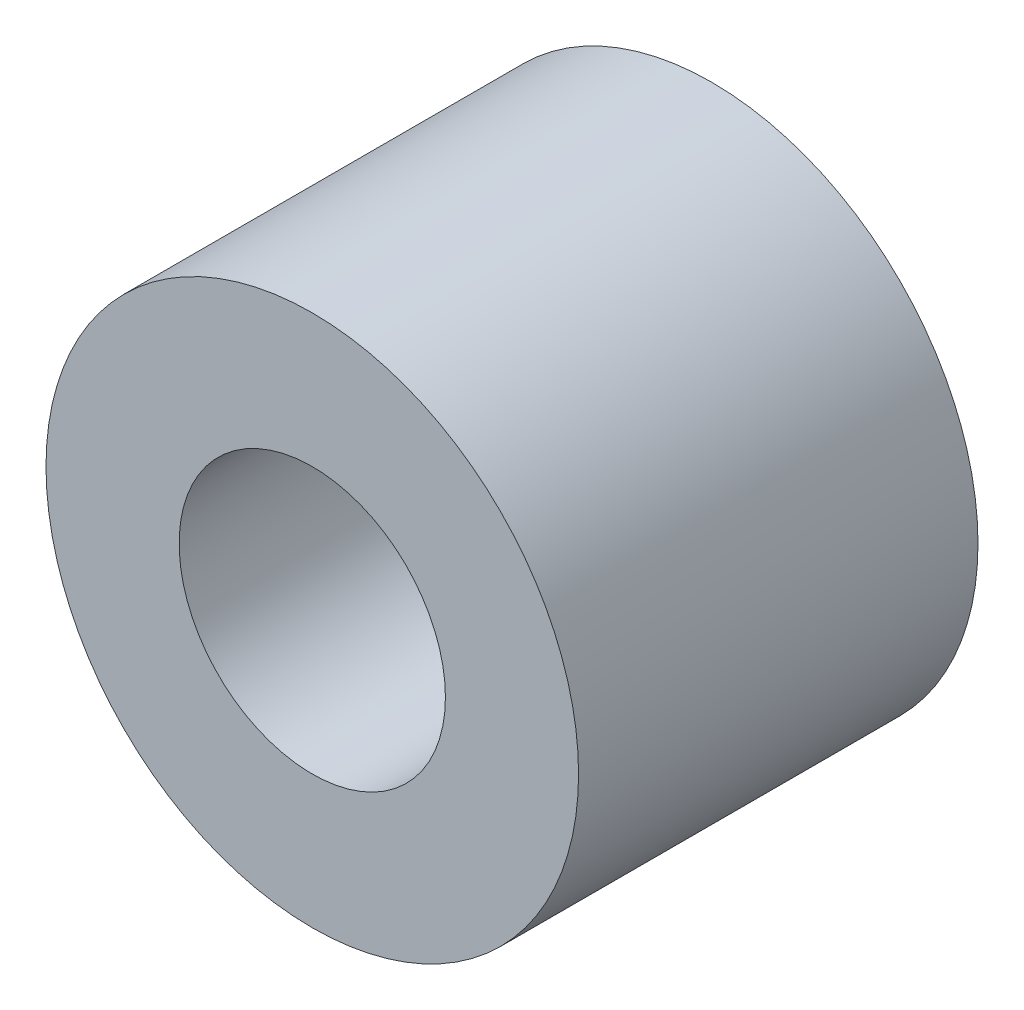
ISO-10303-21;
HEADER;
FILE_DESCRIPTION(('STEP AP214'),'2;1');
FILE_NAME('part.step','',(''),(''),'','','');
FILE_SCHEMA(('AUTOMOTIVE_DESIGN { 1 0 10303 214 1 1 1 1 }'));
ENDSEC;
DATA;
#1=APPLICATION_CONTEXT('core data for automotive mechanical design processes');
#2=APPLICATION_PROTOCOL_DEFINITION('international standard','automotive_design',2000,#1);
#3=PRODUCT_CONTEXT('',#1,'mechanical');
#4=PRODUCT('Part','Part','',(#3));
#5=PRODUCT_RELATED_PRODUCT_CATEGORY('part','',(#4));
#6=PRODUCT_DEFINITION_FORMATION('','',#4);
#7=PRODUCT_DEFINITION_CONTEXT('part definition',#1,'design');
#8=PRODUCT_DEFINITION('design','',#6,#7);
#9=PRODUCT_DEFINITION_SHAPE('','',#8);
#10=(LENGTH_UNIT() NAMED_UNIT(*) SI_UNIT(.MILLI.,.METRE.));
#11=(NAMED_UNIT(*) PLANE_ANGLE_UNIT() SI_UNIT($,.RADIAN.));
#12=(NAMED_UNIT(*) SI_UNIT($,.STERADIAN.) SOLID_ANGLE_UNIT());
#13=UNCERTAINTY_MEASURE_WITH_UNIT(LENGTH_MEASURE(1.E-05),#10,'distance_accuracy_value','');
#14=(GEOMETRIC_REPRESENTATION_CONTEXT(3) GLOBAL_UNCERTAINTY_ASSIGNED_CONTEXT((#13)) GLOBAL_UNIT_ASSIGNED_CONTEXT((#10,
#11,#12)) REPRESENTATION_CONTEXT('',''));
#15=CARTESIAN_POINT('',(0.,0.,0.));
#16=DIRECTION('',(0.,0.,1.));
#17=DIRECTION('',(1.,0.,0.));
#18=AXIS2_PLACEMENT_3D('',#15,#16,#17);
#19=CARTESIAN_POINT('',(0.,0.,3.));
#20=DIRECTION('',(0.,0.,1.));
#21=DIRECTION('',(1.,0.,0.));
#22=AXIS2_PLACEMENT_3D('',#19,#20,#21);
#23=PLANE('',#22);
#24=CARTESIAN_POINT('',(0.,0.,3.));
#25=DIRECTION('',(0.,0.,1.));
#26=DIRECTION('',(1.,0.,0.));
#27=AXIS2_PLACEMENT_3D('',#24,#25,#26);
#28=CIRCLE('',#27,4.);
#29=CARTESIAN_POINT('',(4.,0.,3.));
#30=VERTEX_POINT('',#29);
#31=EDGE_CURVE('E10',#30,#30,#28,.T.);
#32=ORIENTED_EDGE('',*,*,#31,.T.);
#33=EDGE_LOOP('',(#32));
#34=FACE_BOUND('',#33,.T.);
#35=CARTESIAN_POINT('',(0.,0.,3.));
#36=DIRECTION('',(0.,0.,1.));
#37=DIRECTION('',(1.,0.,0.));
#38=AXIS2_PLACEMENT_3D('',#35,#36,#37);
#39=CIRCLE('',#38,2.);
#40=CARTESIAN_POINT('',(2.,0.,3.));
#41=VERTEX_POINT('',#40);
#42=EDGE_CURVE('E53',#41,#41,#39,.T.);
#43=ORIENTED_EDGE('',*,*,#42,.F.);
#44=EDGE_LOOP('',(#43));
#45=FACE_BOUND('',#44,.T.);
#46=ADVANCED_FACE('F42',(#34,#45),#23,.T.);
#47=CARTESIAN_POINT('',(0.,0.,-3.));
#48=DIRECTION('',(0.,0.,1.));
#49=DIRECTION('',(1.,0.,0.));
#50=AXIS2_PLACEMENT_3D('',#47,#48,#49);
#51=PLANE('',#50);
#52=CARTESIAN_POINT('',(0.,0.,-3.));
#53=DIRECTION('',(0.,0.,1.));
#54=DIRECTION('',(1.,0.,0.));
#55=AXIS2_PLACEMENT_3D('',#52,#53,#54);
#56=CIRCLE('',#55,4.);
#57=CARTESIAN_POINT('',(4.,0.,-3.));
#58=VERTEX_POINT('',#57);
#59=EDGE_CURVE('E46',#58,#58,#56,.T.);
#60=ORIENTED_EDGE('',*,*,#59,.F.);
#61=EDGE_LOOP('',(#60));
#62=FACE_BOUND('',#61,.T.);
#63=CARTESIAN_POINT('',(0.,0.,-3.));
#64=DIRECTION('',(0.,0.,1.));
#65=DIRECTION('',(1.,0.,0.));
#66=AXIS2_PLACEMENT_3D('',#63,#64,#65);
#67=CIRCLE('',#66,2.);
#68=CARTESIAN_POINT('',(2.,0.,-3.));
#69=VERTEX_POINT('',#68);
#70=EDGE_CURVE('E55',#69,#69,#67,.T.);
#71=ORIENTED_EDGE('',*,*,#70,.T.);
#72=EDGE_LOOP('',(#71));
#73=FACE_BOUND('',#72,.T.);
#74=ADVANCED_FACE('F65',(#62,#73),#51,.F.);
#75=CARTESIAN_POINT('',(0.,0.,3.));
#76=DIRECTION('',(0.,0.,-1.));
#77=DIRECTION('',(-1.,0.,0.));
#78=AXIS2_PLACEMENT_3D('',#75,#76,#77);
#79=CYLINDRICAL_SURFACE('',#78,4.);
#80=ORIENTED_EDGE('',*,*,#31,.F.);
#81=EDGE_LOOP('',(#80));
#82=FACE_BOUND('',#81,.T.);
#83=ORIENTED_EDGE('',*,*,#59,.T.);
#84=EDGE_LOOP('',(#83));
#85=FACE_BOUND('',#84,.T.);
#86=ADVANCED_FACE('F44',(#82,#85),#79,.T.);
#87=CARTESIAN_POINT('',(0.,0.,3.));
#88=DIRECTION('',(0.,0.,-1.));
#89=DIRECTION('',(-1.,0.,0.));
#90=AXIS2_PLACEMENT_3D('',#87,#88,#89);
#91=CYLINDRICAL_SURFACE('',#90,2.);
#92=ORIENTED_EDGE('',*,*,#42,.T.);
#93=EDGE_LOOP('',(#92));
#94=FACE_BOUND('',#93,.T.);
#95=ORIENTED_EDGE('',*,*,#70,.F.);
#96=EDGE_LOOP('',(#95));
#97=FACE_BOUND('',#96,.T.);
#98=ADVANCED_FACE('F61',(#94,#97),#91,.F.);
#99=CLOSED_SHELL('',(#46,#74,#86,#98));
#100=MANIFOLD_SOLID_BREP('B2',#99);
#101=ADVANCED_BREP_SHAPE_REPRESENTATION('',(#18,#100),#14);
#102=SHAPE_DEFINITION_REPRESENTATION(#9,#101);
ENDSEC;
END-ISO-10303-21;
